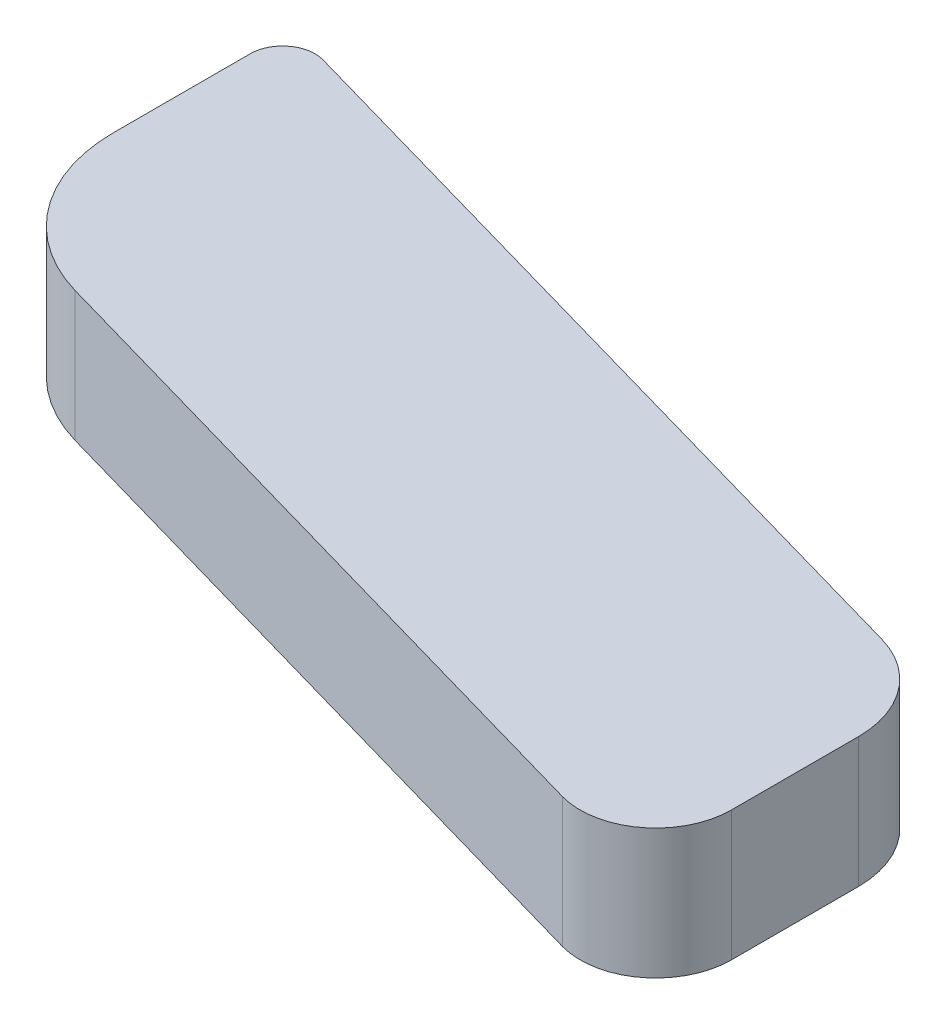
ISO-10303-21;
HEADER;
FILE_DESCRIPTION(('STEP AP214'),'2;1');
FILE_NAME('part.step','',(''),(''),'','','');
FILE_SCHEMA(('AUTOMOTIVE_DESIGN { 1 0 10303 214 1 1 1 1 }'));
ENDSEC;
DATA;
#1=APPLICATION_CONTEXT('core data for automotive mechanical design processes');
#2=APPLICATION_PROTOCOL_DEFINITION('international standard','automotive_design',2000,#1);
#3=PRODUCT_CONTEXT('',#1,'mechanical');
#4=PRODUCT('Part','Part','',(#3));
#5=PRODUCT_RELATED_PRODUCT_CATEGORY('part','',(#4));
#6=PRODUCT_DEFINITION_FORMATION('','',#4);
#7=PRODUCT_DEFINITION_CONTEXT('part definition',#1,'design');
#8=PRODUCT_DEFINITION('design','',#6,#7);
#9=PRODUCT_DEFINITION_SHAPE('','',#8);
#10=(LENGTH_UNIT() NAMED_UNIT(*) SI_UNIT(.MILLI.,.METRE.));
#11=(NAMED_UNIT(*) PLANE_ANGLE_UNIT() SI_UNIT($,.RADIAN.));
#12=(NAMED_UNIT(*) SI_UNIT($,.STERADIAN.) SOLID_ANGLE_UNIT());
#13=UNCERTAINTY_MEASURE_WITH_UNIT(LENGTH_MEASURE(1.E-05),#10,'distance_accuracy_value','');
#14=(GEOMETRIC_REPRESENTATION_CONTEXT(3) GLOBAL_UNCERTAINTY_ASSIGNED_CONTEXT((#13)) GLOBAL_UNIT_ASSIGNED_CONTEXT((#10,
#11,#12)) REPRESENTATION_CONTEXT('',''));
#15=CARTESIAN_POINT('',(0.,0.,0.));
#16=DIRECTION('',(0.,0.,1.));
#17=DIRECTION('',(1.,0.,0.));
#18=AXIS2_PLACEMENT_3D('',#15,#16,#17);
#19=CARTESIAN_POINT('',(0.463533965103902,2.9956,0.272902318588757));
#20=DIRECTION('',(0.,-1.,0.));
#21=DIRECTION('',(-1.,0.,0.));
#22=AXIS2_PLACEMENT_3D('',#19,#20,#21);
#23=CYLINDRICAL_SURFACE('',#22,0.0378378378378465);
#24=CARTESIAN_POINT('',(0.463533965103902,2.9306,0.272902318588757));
#25=DIRECTION('',(0.,1.,0.));
#26=DIRECTION('',(1.,0.,0.));
#27=AXIS2_PLACEMENT_3D('',#24,#25,#26);
#28=CIRCLE('',#27,0.0378378378378465);
#29=CARTESIAN_POINT('',(0.453150834478406,2.9306,0.309287653143453));
#30=VERTEX_POINT('',#29);
#31=CARTESIAN_POINT('',(0.501371802941747,2.9306,0.272902318588757));
#32=VERTEX_POINT('',#31);
#33=EDGE_CURVE('E11',#30,#32,#28,.T.);
#34=ORIENTED_EDGE('',*,*,#33,.T.);
#35=DIRECTION('',(0.,-1.,0.));
#36=VECTOR('',#35,1.);
#37=CARTESIAN_POINT('',(0.501371802941747,2.9956,0.272902318588757));
#38=LINE('',#37,#36);
#39=CARTESIAN_POINT('',(0.501371802941747,2.9956,0.272902318588757));
#40=VERTEX_POINT('',#39);
#41=EDGE_CURVE('E24',#40,#32,#38,.T.);
#42=ORIENTED_EDGE('',*,*,#41,.F.);
#43=CARTESIAN_POINT('',(0.463533965103902,2.9956,0.272902318588757));
#44=DIRECTION('',(0.,1.,0.));
#45=DIRECTION('',(1.,0.,0.));
#46=AXIS2_PLACEMENT_3D('',#43,#44,#45);
#47=CIRCLE('',#46,0.0378378378378465);
#48=CARTESIAN_POINT('',(0.453150834478406,2.9956,0.309287653143453));
#49=VERTEX_POINT('',#48);
#50=EDGE_CURVE('E144',#49,#40,#47,.T.);
#51=ORIENTED_EDGE('',*,*,#50,.F.);
#52=DIRECTION('',(0.,-1.,0.));
#53=VECTOR('',#52,1.);
#54=CARTESIAN_POINT('',(0.453150834478406,2.9956,0.309287653143453));
#55=LINE('',#54,#53);
#56=EDGE_CURVE('E102',#49,#30,#55,.T.);
#57=ORIENTED_EDGE('',*,*,#56,.T.);
#58=EDGE_LOOP('',(#34,#42,#51,#57));
#59=FACE_BOUND('',#58,.T.);
#60=ADVANCED_FACE('F17',(#59),#23,.T.);
#61=CARTESIAN_POINT('',(0.501371802941747,2.9956,0.272902318588757));
#62=DIRECTION('',(-1.,0.,0.));
#63=DIRECTION('',(0.,1.,0.));
#64=AXIS2_PLACEMENT_3D('',#61,#62,#63);
#65=PLANE('',#64);
#66=DIRECTION('',(0.,0.,-1.));
#67=VECTOR('',#66,1.);
#68=CARTESIAN_POINT('',(0.501371802941747,2.9306,0.272902318588757));
#69=LINE('',#68,#67);
#70=CARTESIAN_POINT('',(0.501371802941747,2.9306,0.209274506739315));
#71=VERTEX_POINT('',#70);
#72=EDGE_CURVE('E141',#32,#71,#69,.T.);
#73=ORIENTED_EDGE('',*,*,#72,.T.);
#74=DIRECTION('',(0.,-1.,0.));
#75=VECTOR('',#74,1.);
#76=CARTESIAN_POINT('',(0.501371802941747,2.9956,0.209274506739315));
#77=LINE('',#76,#75);
#78=CARTESIAN_POINT('',(0.501371802941747,2.9956,0.209274506739315));
#79=VERTEX_POINT('',#78);
#80=EDGE_CURVE('E138',#79,#71,#77,.T.);
#81=ORIENTED_EDGE('',*,*,#80,.F.);
#82=DIRECTION('',(0.,0.,-1.));
#83=VECTOR('',#82,1.);
#84=CARTESIAN_POINT('',(0.501371802941747,2.9956,0.272902318588757));
#85=LINE('',#84,#83);
#86=EDGE_CURVE('E135',#40,#79,#85,.T.);
#87=ORIENTED_EDGE('',*,*,#86,.F.);
#88=ORIENTED_EDGE('',*,*,#41,.T.);
#89=EDGE_LOOP('',(#73,#81,#87,#88));
#90=FACE_BOUND('',#89,.T.);
#91=ADVANCED_FACE('F147',(#90),#65,.F.);
#92=CARTESIAN_POINT('',(0.451425856995761,2.9956,0.209274506739322));
#93=DIRECTION('',(0.,-1.,0.));
#94=DIRECTION('',(-1.,0.,0.));
#95=AXIS2_PLACEMENT_3D('',#92,#93,#94);
#96=CYLINDRICAL_SURFACE('',#95,0.0499459459459856);
#97=CARTESIAN_POINT('',(0.451425856995761,2.9306,0.209274506739322));
#98=DIRECTION('',(0.,1.,0.));
#99=DIRECTION('',(1.,0.,0.));
#100=AXIS2_PLACEMENT_3D('',#97,#98,#99);
#101=CIRCLE('',#100,0.0499459459459856);
#102=CARTESIAN_POINT('',(0.465098259628987,2.9306,0.161236366447734));
#103=VERTEX_POINT('',#102);
#104=EDGE_CURVE('E133',#71,#103,#101,.T.);
#105=ORIENTED_EDGE('',*,*,#104,.T.);
#106=DIRECTION('',(0.,-1.,0.));
#107=VECTOR('',#106,1.);
#108=CARTESIAN_POINT('',(0.465098259628987,2.9956,0.161236366447734));
#109=LINE('',#108,#107);
#110=CARTESIAN_POINT('',(0.465098259628987,2.9956,0.161236366447734));
#111=VERTEX_POINT('',#110);
#112=EDGE_CURVE('E130',#111,#103,#109,.T.);
#113=ORIENTED_EDGE('',*,*,#112,.F.);
#114=CARTESIAN_POINT('',(0.451425856995761,2.9956,0.209274506739322));
#115=DIRECTION('',(0.,1.,0.));
#116=DIRECTION('',(1.,0.,0.));
#117=AXIS2_PLACEMENT_3D('',#114,#115,#116);
#118=CIRCLE('',#117,0.0499459459459856);
#119=EDGE_CURVE('E127',#79,#111,#118,.T.);
#120=ORIENTED_EDGE('',*,*,#119,.F.);
#121=ORIENTED_EDGE('',*,*,#80,.T.);
#122=EDGE_LOOP('',(#105,#113,#120,#121));
#123=FACE_BOUND('',#122,.T.);
#124=ADVANCED_FACE('F153',(#123),#96,.T.);
#125=CARTESIAN_POINT('',(0.465098259628987,2.9956,0.161236366447734));
#126=DIRECTION('',(-0.273743992115513,0.,0.961802592417312));
#127=DIRECTION('',(0.961802592417312,0.,0.273743992115513));
#128=AXIS2_PLACEMENT_3D('',#125,#126,#127);
#129=PLANE('',#128);
#130=DIRECTION('',(-0.961802592417312,0.,-0.273743992115513));
#131=VECTOR('',#130,1.);
#132=CARTESIAN_POINT('',(0.465098259628987,2.9306,0.161236366447734));
#133=LINE('',#132,#131);
#134=CARTESIAN_POINT('',(0.0738620531593008,2.9306,0.0498844509263078));
#135=VERTEX_POINT('',#134);
#136=EDGE_CURVE('E125',#103,#135,#133,.T.);
#137=ORIENTED_EDGE('',*,*,#136,.T.);
#138=DIRECTION('',(0.,-1.,0.));
#139=VECTOR('',#138,1.);
#140=CARTESIAN_POINT('',(0.0738620531593008,2.9956,0.0498844509263078));
#141=LINE('',#140,#139);
#142=CARTESIAN_POINT('',(0.0738620531593008,2.9956,0.0498844509263078));
#143=VERTEX_POINT('',#142);
#144=EDGE_CURVE('E122',#143,#135,#141,.T.);
#145=ORIENTED_EDGE('',*,*,#144,.F.);
#146=DIRECTION('',(-0.961802592417312,0.,-0.273743992115513));
#147=VECTOR('',#146,1.);
#148=CARTESIAN_POINT('',(0.465098259628987,2.9956,0.161236366447734));
#149=LINE('',#148,#147);
#150=EDGE_CURVE('E119',#111,#143,#149,.T.);
#151=ORIENTED_EDGE('',*,*,#150,.F.);
#152=ORIENTED_EDGE('',*,*,#112,.T.);
#153=EDGE_LOOP('',(#137,#145,#151,#152));
#154=FACE_BOUND('',#153,.T.);
#155=ADVANCED_FACE('F157',(#154),#129,.F.);
#156=CARTESIAN_POINT('',(0.0694229613952685,2.9956,0.0654812497223004));
#157=DIRECTION('',(0.,-1.,0.));
#158=DIRECTION('',(-1.,0.,0.));
#159=AXIS2_PLACEMENT_3D('',#156,#157,#158);
#160=CYLINDRICAL_SURFACE('',#159,0.0162162162162497);
#161=CARTESIAN_POINT('',(0.0694229613952685,2.9306,0.0654812497223004));
#162=DIRECTION('',(0.,1.,0.));
#163=DIRECTION('',(1.,0.,0.));
#164=AXIS2_PLACEMENT_3D('',#161,#162,#163);
#165=CIRCLE('',#164,0.0162162162162497);
#166=CARTESIAN_POINT('',(0.0532067452658382,2.9306,0.0654795716984278));
#167=VERTEX_POINT('',#166);
#168=EDGE_CURVE('E117',#135,#167,#165,.T.);
#169=ORIENTED_EDGE('',*,*,#168,.T.);
#170=DIRECTION('',(0.,-1.,0.));
#171=VECTOR('',#170,1.);
#172=CARTESIAN_POINT('',(0.0532067452658382,2.9956,0.0654795716984278));
#173=LINE('',#172,#171);
#174=CARTESIAN_POINT('',(0.0532067452658382,2.9956,0.0654795716984278));
#175=VERTEX_POINT('',#174);
#176=EDGE_CURVE('E114',#175,#167,#173,.T.);
#177=ORIENTED_EDGE('',*,*,#176,.F.);
#178=CARTESIAN_POINT('',(0.0694229613952685,2.9956,0.0654812497223004));
#179=DIRECTION('',(0.,1.,0.));
#180=DIRECTION('',(1.,0.,0.));
#181=AXIS2_PLACEMENT_3D('',#178,#179,#180);
#182=CIRCLE('',#181,0.0162162162162497);
#183=EDGE_CURVE('E112',#143,#175,#182,.T.);
#184=ORIENTED_EDGE('',*,*,#183,.F.);
#185=ORIENTED_EDGE('',*,*,#144,.T.);
#186=EDGE_LOOP('',(#169,#177,#184,#185));
#187=FACE_BOUND('',#186,.T.);
#188=ADVANCED_FACE('F160',(#187),#160,.T.);
#189=CARTESIAN_POINT('',(0.0532067452658387,2.9956,0.0654795716984278));
#190=DIRECTION('',(0.999999994646137,0.,0.000103478139276054));
#191=DIRECTION('',(0.000103478139276054,0.,-0.999999994646137));
#192=AXIS2_PLACEMENT_3D('',#189,#190,#191);
#193=PLANE('',#192);
#194=DIRECTION('',(-0.000103478139276054,0.,0.999999994646137));
#195=VECTOR('',#194,1.);
#196=CARTESIAN_POINT('',(0.0532067452658387,2.9306,0.0654795716984278));
#197=LINE('',#196,#195);
#198=CARTESIAN_POINT('',(0.0531996583349459,2.9306,0.133966799092186));
#199=VERTEX_POINT('',#198);
#200=EDGE_CURVE('E110',#167,#199,#197,.T.);
#201=ORIENTED_EDGE('',*,*,#200,.T.);
#202=DIRECTION('',(0.,-1.,0.));
#203=VECTOR('',#202,1.);
#204=CARTESIAN_POINT('',(0.0531996583349459,2.9956,0.133966799092186));
#205=LINE('',#204,#203);
#206=CARTESIAN_POINT('',(0.0531996583349459,2.9956,0.133966799092186));
#207=VERTEX_POINT('',#206);
#208=EDGE_CURVE('E108',#207,#199,#205,.T.);
#209=ORIENTED_EDGE('',*,*,#208,.F.);
#210=DIRECTION('',(-0.000103478139276054,0.,0.999999994646137));
#211=VECTOR('',#210,1.);
#212=CARTESIAN_POINT('',(0.0532067452658387,2.9956,0.0654795716984278));
#213=LINE('',#212,#211);
#214=EDGE_CURVE('E97',#175,#207,#213,.T.);
#215=ORIENTED_EDGE('',*,*,#214,.F.);
#216=ORIENTED_EDGE('',*,*,#176,.T.);
#217=EDGE_LOOP('',(#201,#209,#215,#216));
#218=FACE_BOUND('',#217,.T.);
#219=ADVANCED_FACE('F163',(#218),#193,.F.);
#220=CARTESIAN_POINT('',(0.134280738981897,2.9956,0.133975189211629));
#221=DIRECTION('',(0.,-1.,0.));
#222=DIRECTION('',(-1.,0.,0.));
#223=AXIS2_PLACEMENT_3D('',#220,#221,#222);
#224=CYLINDRICAL_SURFACE('',#223,0.0810810810810476);
#225=CARTESIAN_POINT('',(0.134280738981897,2.9306,0.133975189211629));
#226=DIRECTION('',(0.,1.,0.));
#227=DIRECTION('',(1.,0.,0.));
#228=AXIS2_PLACEMENT_3D('',#225,#226,#227);
#229=CIRCLE('',#228,0.0810810810810476);
#230=CARTESIAN_POINT('',(0.11203117335583,2.9306,0.211943763257348));
#231=VERTEX_POINT('',#230);
#232=EDGE_CURVE('E84',#199,#231,#229,.T.);
#233=ORIENTED_EDGE('',*,*,#232,.T.);
#234=DIRECTION('',(0.,-1.,0.));
#235=VECTOR('',#234,1.);
#236=CARTESIAN_POINT('',(0.11203117335583,2.9956,0.211943763257348));
#237=LINE('',#236,#235);
#238=CARTESIAN_POINT('',(0.11203117335583,2.9956,0.211943763257348));
#239=VERTEX_POINT('',#238);
#240=EDGE_CURVE('E78',#239,#231,#237,.T.);
#241=ORIENTED_EDGE('',*,*,#240,.F.);
#242=CARTESIAN_POINT('',(0.134280738981897,2.9956,0.133975189211629));
#243=DIRECTION('',(0.,1.,0.));
#244=DIRECTION('',(1.,0.,0.));
#245=AXIS2_PLACEMENT_3D('',#242,#243,#244);
#246=CIRCLE('',#245,0.0810810810810476);
#247=EDGE_CURVE('E82',#207,#239,#246,.T.);
#248=ORIENTED_EDGE('',*,*,#247,.F.);
#249=ORIENTED_EDGE('',*,*,#208,.T.);
#250=EDGE_LOOP('',(#233,#241,#248,#249));
#251=FACE_BOUND('',#250,.T.);
#252=ADVANCED_FACE('F80',(#251),#224,.T.);
#253=CARTESIAN_POINT('',(0.11203117335583,2.9956,0.211943763257347));
#254=DIRECTION('',(0.274411309388094,0.,-0.961612413230981));
#255=DIRECTION('',(-0.961612413230981,0.,-0.274411309388094));
#256=AXIS2_PLACEMENT_3D('',#253,#254,#255);
#257=PLANE('',#256);
#258=DIRECTION('',(0.961612413230981,0.,0.274411309388094));
#259=VECTOR('',#258,1.);
#260=CARTESIAN_POINT('',(0.11203117335583,2.9306,0.211943763257347));
#261=LINE('',#260,#259);
#262=EDGE_CURVE('E98',#231,#30,#261,.T.);
#263=ORIENTED_EDGE('',*,*,#262,.T.);
#264=ORIENTED_EDGE('',*,*,#56,.F.);
#265=DIRECTION('',(0.961612413230981,0.,0.274411309388094));
#266=VECTOR('',#265,1.);
#267=CARTESIAN_POINT('',(0.11203117335583,2.9956,0.211943763257347));
#268=LINE('',#267,#266);
#269=EDGE_CURVE('E94',#239,#49,#268,.T.);
#270=ORIENTED_EDGE('',*,*,#269,.F.);
#271=ORIENTED_EDGE('',*,*,#240,.T.);
#272=EDGE_LOOP('',(#263,#264,#270,#271));
#273=FACE_BOUND('',#272,.T.);
#274=ADVANCED_FACE('F101',(#273),#257,.F.);
#275=CARTESIAN_POINT('',(0.463533965103902,2.9956,0.272902318588757));
#276=DIRECTION('',(0.,1.,0.));
#277=DIRECTION('',(1.,0.,0.));
#278=AXIS2_PLACEMENT_3D('',#275,#276,#277);
#279=PLANE('',#278);
#280=ORIENTED_EDGE('',*,*,#50,.T.);
#281=ORIENTED_EDGE('',*,*,#86,.T.);
#282=ORIENTED_EDGE('',*,*,#119,.T.);
#283=ORIENTED_EDGE('',*,*,#150,.T.);
#284=ORIENTED_EDGE('',*,*,#183,.T.);
#285=ORIENTED_EDGE('',*,*,#214,.T.);
#286=ORIENTED_EDGE('',*,*,#247,.T.);
#287=ORIENTED_EDGE('',*,*,#269,.T.);
#288=EDGE_LOOP('',(#280,#281,#282,#283,#284,#285,#286,#287));
#289=FACE_BOUND('',#288,.T.);
#290=ADVANCED_FACE('F93',(#289),#279,.T.);
#291=CARTESIAN_POINT('',(0.463533965103902,2.9306,0.272902318588757));
#292=DIRECTION('',(0.,1.,0.));
#293=DIRECTION('',(1.,0.,0.));
#294=AXIS2_PLACEMENT_3D('',#291,#292,#293);
#295=PLANE('',#294);
#296=ORIENTED_EDGE('',*,*,#33,.F.);
#297=ORIENTED_EDGE('',*,*,#262,.F.);
#298=ORIENTED_EDGE('',*,*,#232,.F.);
#299=ORIENTED_EDGE('',*,*,#200,.F.);
#300=ORIENTED_EDGE('',*,*,#168,.F.);
#301=ORIENTED_EDGE('',*,*,#136,.F.);
#302=ORIENTED_EDGE('',*,*,#104,.F.);
#303=ORIENTED_EDGE('',*,*,#72,.F.);
#304=EDGE_LOOP('',(#296,#297,#298,#299,#300,#301,#302,#303));
#305=FACE_BOUND('',#304,.T.);
#306=ADVANCED_FACE('F149',(#305),#295,.F.);
#307=CLOSED_SHELL('',(#60,#91,#124,#155,#188,#219,#252,#274,#290,#306));
#308=MANIFOLD_SOLID_BREP('B1',#307);
#309=ADVANCED_BREP_SHAPE_REPRESENTATION('',(#18,#308),#14);
#310=SHAPE_DEFINITION_REPRESENTATION(#9,#309);
ENDSEC;
END-ISO-10303-21;
